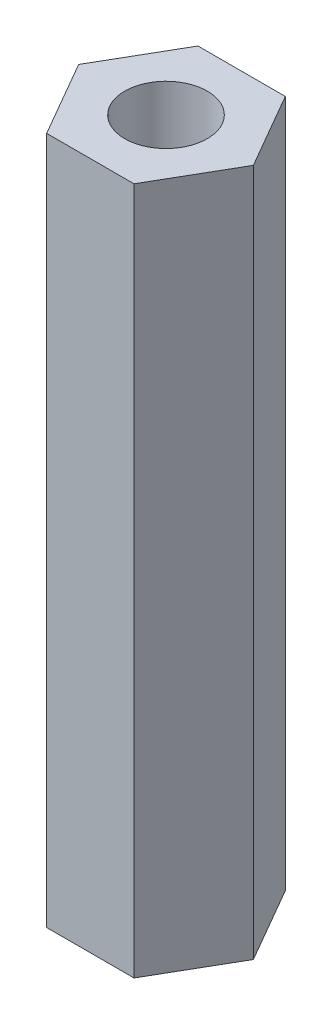
ISO-10303-21;
HEADER;
FILE_DESCRIPTION(('STEP AP214'),'2;1');
FILE_NAME('part.step','',(''),(''),'','','');
FILE_SCHEMA(('AUTOMOTIVE_DESIGN { 1 0 10303 214 1 1 1 1 }'));
ENDSEC;
DATA;
#1=APPLICATION_CONTEXT('core data for automotive mechanical design processes');
#2=APPLICATION_PROTOCOL_DEFINITION('international standard','automotive_design',2000,#1);
#3=PRODUCT_CONTEXT('',#1,'mechanical');
#4=PRODUCT('Part','Part','',(#3));
#5=PRODUCT_RELATED_PRODUCT_CATEGORY('part','',(#4));
#6=PRODUCT_DEFINITION_FORMATION('','',#4);
#7=PRODUCT_DEFINITION_CONTEXT('part definition',#1,'design');
#8=PRODUCT_DEFINITION('design','',#6,#7);
#9=PRODUCT_DEFINITION_SHAPE('','',#8);
#10=(LENGTH_UNIT() NAMED_UNIT(*) SI_UNIT(.MILLI.,.METRE.));
#11=(NAMED_UNIT(*) PLANE_ANGLE_UNIT() SI_UNIT($,.RADIAN.));
#12=(NAMED_UNIT(*) SI_UNIT($,.STERADIAN.) SOLID_ANGLE_UNIT());
#13=UNCERTAINTY_MEASURE_WITH_UNIT(LENGTH_MEASURE(1.E-05),#10,'distance_accuracy_value','');
#14=(GEOMETRIC_REPRESENTATION_CONTEXT(3) GLOBAL_UNCERTAINTY_ASSIGNED_CONTEXT((#13)) GLOBAL_UNIT_ASSIGNED_CONTEXT((#10,
#11,#12)) REPRESENTATION_CONTEXT('',''));
#15=CARTESIAN_POINT('',(0.,0.,0.));
#16=DIRECTION('',(0.,0.,1.));
#17=DIRECTION('',(1.,0.,0.));
#18=AXIS2_PLACEMENT_3D('',#15,#16,#17);
#19=CARTESIAN_POINT('',(0.,25.,0.));
#20=DIRECTION('',(0.,1.,0.));
#21=DIRECTION('',(0.,0.,1.));
#22=AXIS2_PLACEMENT_3D('',#19,#20,#21);
#23=PLANE('',#22);
#24=DIRECTION('',(0.5,0.,-0.866025403784439));
#25=VECTOR('',#24,1.);
#26=CARTESIAN_POINT('',(-5.73489304903012,25.,-4.82224059461863));
#27=LINE('',#26,#25);
#28=CARTESIAN_POINT('',(-5.73489304903012,25.,-4.82224059461863));
#29=VERTEX_POINT('',#28);
#30=CARTESIAN_POINT('',(-4.14717980875865,25.,-7.57224059461863));
#31=VERTEX_POINT('',#30);
#32=EDGE_CURVE('E133',#29,#31,#27,.T.);
#33=ORIENTED_EDGE('',*,*,#32,.T.);
#34=DIRECTION('',(-0.5,0.,-0.866025403784439));
#35=VECTOR('',#34,1.);
#36=CARTESIAN_POINT('',(-4.14717980875865,25.,-7.57224059461863));
#37=LINE('',#36,#35);
#38=CARTESIAN_POINT('',(-5.73489304903012,25.,-10.3222405946186));
#39=VERTEX_POINT('',#38);
#40=EDGE_CURVE('E91',#31,#39,#37,.T.);
#41=ORIENTED_EDGE('',*,*,#40,.T.);
#42=DIRECTION('',(-1.,0.,0.));
#43=VECTOR('',#42,1.);
#44=CARTESIAN_POINT('',(-5.73489304903012,25.,-10.3222405946186));
#45=LINE('',#44,#43);
#46=CARTESIAN_POINT('',(-8.91031952957306,25.,-10.3222405946186));
#47=VERTEX_POINT('',#46);
#48=EDGE_CURVE('E104',#39,#47,#45,.T.);
#49=ORIENTED_EDGE('',*,*,#48,.T.);
#50=DIRECTION('',(-0.5,0.,0.866025403784439));
#51=VECTOR('',#50,1.);
#52=CARTESIAN_POINT('',(-8.91031952957306,25.,-10.3222405946186));
#53=LINE('',#52,#51);
#54=CARTESIAN_POINT('',(-10.4980327698445,25.,-7.57224059461863));
#55=VERTEX_POINT('',#54);
#56=EDGE_CURVE('E98',#47,#55,#53,.T.);
#57=ORIENTED_EDGE('',*,*,#56,.T.);
#58=DIRECTION('',(0.5,0.,0.866025403784439));
#59=VECTOR('',#58,1.);
#60=CARTESIAN_POINT('',(-10.4980327698445,25.,-7.57224059461863));
#61=LINE('',#60,#59);
#62=CARTESIAN_POINT('',(-8.91031952957306,25.,-4.82224059461863));
#63=VERTEX_POINT('',#62);
#64=EDGE_CURVE('E102',#55,#63,#61,.T.);
#65=ORIENTED_EDGE('',*,*,#64,.T.);
#66=DIRECTION('',(1.,0.,0.));
#67=VECTOR('',#66,1.);
#68=CARTESIAN_POINT('',(-8.91031952957306,25.,-4.82224059461863));
#69=LINE('',#68,#67);
#70=EDGE_CURVE('E54',#63,#29,#69,.T.);
#71=ORIENTED_EDGE('',*,*,#70,.T.);
#72=EDGE_LOOP('',(#33,#41,#49,#57,#65,#71));
#73=FACE_BOUND('',#72,.T.);
#74=CARTESIAN_POINT('',(-7.32260628930159,25.,-7.57224059461863));
#75=DIRECTION('',(0.,1.,0.));
#76=DIRECTION('',(0.,0.,1.));
#77=AXIS2_PLACEMENT_3D('',#74,#75,#76);
#78=CIRCLE('',#77,1.5);
#79=CARTESIAN_POINT('',(-7.32260628930159,25.,-6.07224059461863));
#80=VERTEX_POINT('',#79);
#81=EDGE_CURVE('E126',#80,#80,#78,.T.);
#82=ORIENTED_EDGE('',*,*,#81,.F.);
#83=EDGE_LOOP('',(#82));
#84=FACE_BOUND('',#83,.T.);
#85=ADVANCED_FACE('F37',(#73,#84),#23,.T.);
#86=CARTESIAN_POINT('',(0.,0.,0.));
#87=DIRECTION('',(0.,1.,0.));
#88=DIRECTION('',(0.,0.,1.));
#89=AXIS2_PLACEMENT_3D('',#86,#87,#88);
#90=PLANE('',#89);
#91=DIRECTION('',(0.5,0.,-0.866025403784439));
#92=VECTOR('',#91,1.);
#93=CARTESIAN_POINT('',(-5.73489304903012,0.,-4.82224059461863));
#94=LINE('',#93,#92);
#95=CARTESIAN_POINT('',(-5.73489304903012,0.,-4.82224059461863));
#96=VERTEX_POINT('',#95);
#97=CARTESIAN_POINT('',(-4.14717980875865,0.,-7.57224059461863));
#98=VERTEX_POINT('',#97);
#99=EDGE_CURVE('E122',#96,#98,#94,.T.);
#100=ORIENTED_EDGE('',*,*,#99,.F.);
#101=DIRECTION('',(1.,0.,0.));
#102=VECTOR('',#101,1.);
#103=CARTESIAN_POINT('',(-8.91031952957306,0.,-4.82224059461863));
#104=LINE('',#103,#102);
#105=CARTESIAN_POINT('',(-8.91031952957306,0.,-4.82224059461863));
#106=VERTEX_POINT('',#105);
#107=EDGE_CURVE('E83',#106,#96,#104,.T.);
#108=ORIENTED_EDGE('',*,*,#107,.F.);
#109=DIRECTION('',(0.5,0.,0.866025403784439));
#110=VECTOR('',#109,1.);
#111=CARTESIAN_POINT('',(-10.4980327698445,0.,-7.57224059461863));
#112=LINE('',#111,#110);
#113=CARTESIAN_POINT('',(-10.4980327698445,0.,-7.57224059461863));
#114=VERTEX_POINT('',#113);
#115=EDGE_CURVE('E77',#114,#106,#112,.T.);
#116=ORIENTED_EDGE('',*,*,#115,.F.);
#117=DIRECTION('',(-0.5,0.,0.866025403784439));
#118=VECTOR('',#117,1.);
#119=CARTESIAN_POINT('',(-8.91031952957306,0.,-10.3222405946186));
#120=LINE('',#119,#118);
#121=CARTESIAN_POINT('',(-8.91031952957306,0.,-10.3222405946186));
#122=VERTEX_POINT('',#121);
#123=EDGE_CURVE('E112',#122,#114,#120,.T.);
#124=ORIENTED_EDGE('',*,*,#123,.F.);
#125=DIRECTION('',(-1.,0.,0.));
#126=VECTOR('',#125,1.);
#127=CARTESIAN_POINT('',(-5.73489304903012,0.,-10.3222405946186));
#128=LINE('',#127,#126);
#129=CARTESIAN_POINT('',(-5.73489304903012,0.,-10.3222405946186));
#130=VERTEX_POINT('',#129);
#131=EDGE_CURVE('E128',#130,#122,#128,.T.);
#132=ORIENTED_EDGE('',*,*,#131,.F.);
#133=DIRECTION('',(-0.5,0.,-0.866025403784439));
#134=VECTOR('',#133,1.);
#135=CARTESIAN_POINT('',(-4.14717980875865,0.,-7.57224059461863));
#136=LINE('',#135,#134);
#137=EDGE_CURVE('E125',#98,#130,#136,.T.);
#138=ORIENTED_EDGE('',*,*,#137,.F.);
#139=EDGE_LOOP('',(#100,#108,#116,#124,#132,#138));
#140=FACE_BOUND('',#139,.T.);
#141=CARTESIAN_POINT('',(-7.32260628930159,0.,-7.57224059461863));
#142=DIRECTION('',(0.,1.,0.));
#143=DIRECTION('',(0.,0.,1.));
#144=AXIS2_PLACEMENT_3D('',#141,#142,#143);
#145=CIRCLE('',#144,1.5);
#146=CARTESIAN_POINT('',(-7.32260628930159,0.,-6.07224059461863));
#147=VERTEX_POINT('',#146);
#148=EDGE_CURVE('E226',#147,#147,#145,.T.);
#149=ORIENTED_EDGE('',*,*,#148,.T.);
#150=EDGE_LOOP('',(#149));
#151=FACE_BOUND('',#150,.T.);
#152=ADVANCED_FACE('F142',(#140,#151),#90,.F.);
#153=CARTESIAN_POINT('',(-5.73489304903012,25.,-4.82224059461863));
#154=DIRECTION('',(-0.866025403784439,0.,-0.5));
#155=DIRECTION('',(-0.5,0.,0.866025403784439));
#156=AXIS2_PLACEMENT_3D('',#153,#154,#155);
#157=PLANE('',#156);
#158=ORIENTED_EDGE('',*,*,#99,.T.);
#159=DIRECTION('',(0.,-1.,0.));
#160=VECTOR('',#159,1.);
#161=CARTESIAN_POINT('',(-4.14717980875865,25.,-7.57224059461863));
#162=LINE('',#161,#160);
#163=EDGE_CURVE('E11',#31,#98,#162,.T.);
#164=ORIENTED_EDGE('',*,*,#163,.F.);
#165=ORIENTED_EDGE('',*,*,#32,.F.);
#166=DIRECTION('',(0.,-1.,0.));
#167=VECTOR('',#166,1.);
#168=CARTESIAN_POINT('',(-5.73489304903012,25.,-4.82224059461863));
#169=LINE('',#168,#167);
#170=EDGE_CURVE('E118',#29,#96,#169,.T.);
#171=ORIENTED_EDGE('',*,*,#170,.T.);
#172=EDGE_LOOP('',(#158,#164,#165,#171));
#173=FACE_BOUND('',#172,.T.);
#174=ADVANCED_FACE('F39',(#173),#157,.F.);
#175=CARTESIAN_POINT('',(-4.14717980875865,25.,-7.57224059461863));
#176=DIRECTION('',(-0.866025403784439,0.,0.5));
#177=DIRECTION('',(0.5,0.,0.866025403784439));
#178=AXIS2_PLACEMENT_3D('',#175,#176,#177);
#179=PLANE('',#178);
#180=ORIENTED_EDGE('',*,*,#137,.T.);
#181=DIRECTION('',(0.,-1.,0.));
#182=VECTOR('',#181,1.);
#183=CARTESIAN_POINT('',(-5.73489304903012,25.,-10.3222405946186));
#184=LINE('',#183,#182);
#185=EDGE_CURVE('E46',#39,#130,#184,.T.);
#186=ORIENTED_EDGE('',*,*,#185,.F.);
#187=ORIENTED_EDGE('',*,*,#40,.F.);
#188=ORIENTED_EDGE('',*,*,#163,.T.);
#189=EDGE_LOOP('',(#180,#186,#187,#188));
#190=FACE_BOUND('',#189,.T.);
#191=ADVANCED_FACE('F167',(#190),#179,.F.);
#192=CARTESIAN_POINT('',(-5.73489304903012,25.,-10.3222405946186));
#193=DIRECTION('',(0.,0.,1.));
#194=DIRECTION('',(1.,0.,0.));
#195=AXIS2_PLACEMENT_3D('',#192,#193,#194);
#196=PLANE('',#195);
#197=ORIENTED_EDGE('',*,*,#131,.T.);
#198=DIRECTION('',(0.,-1.,0.));
#199=VECTOR('',#198,1.);
#200=CARTESIAN_POINT('',(-8.91031952957306,25.,-10.3222405946186));
#201=LINE('',#200,#199);
#202=EDGE_CURVE('E113',#47,#122,#201,.T.);
#203=ORIENTED_EDGE('',*,*,#202,.F.);
#204=ORIENTED_EDGE('',*,*,#48,.F.);
#205=ORIENTED_EDGE('',*,*,#185,.T.);
#206=EDGE_LOOP('',(#197,#203,#204,#205));
#207=FACE_BOUND('',#206,.T.);
#208=ADVANCED_FACE('F139',(#207),#196,.F.);
#209=CARTESIAN_POINT('',(-8.91031952957306,25.,-10.3222405946186));
#210=DIRECTION('',(0.866025403784439,0.,0.5));
#211=DIRECTION('',(0.5,0.,-0.866025403784439));
#212=AXIS2_PLACEMENT_3D('',#209,#210,#211);
#213=PLANE('',#212);
#214=ORIENTED_EDGE('',*,*,#123,.T.);
#215=DIRECTION('',(0.,-1.,0.));
#216=VECTOR('',#215,1.);
#217=CARTESIAN_POINT('',(-10.4980327698445,25.,-7.57224059461863));
#218=LINE('',#217,#216);
#219=EDGE_CURVE('E109',#55,#114,#218,.T.);
#220=ORIENTED_EDGE('',*,*,#219,.F.);
#221=ORIENTED_EDGE('',*,*,#56,.F.);
#222=ORIENTED_EDGE('',*,*,#202,.T.);
#223=EDGE_LOOP('',(#214,#220,#221,#222));
#224=FACE_BOUND('',#223,.T.);
#225=ADVANCED_FACE('F110',(#224),#213,.F.);
#226=CARTESIAN_POINT('',(-10.4980327698445,25.,-7.57224059461863));
#227=DIRECTION('',(0.866025403784439,0.,-0.5));
#228=DIRECTION('',(-0.5,0.,-0.866025403784439));
#229=AXIS2_PLACEMENT_3D('',#226,#227,#228);
#230=PLANE('',#229);
#231=ORIENTED_EDGE('',*,*,#115,.T.);
#232=DIRECTION('',(0.,-1.,0.));
#233=VECTOR('',#232,1.);
#234=CARTESIAN_POINT('',(-8.91031952957306,25.,-4.82224059461863));
#235=LINE('',#234,#233);
#236=EDGE_CURVE('E114',#63,#106,#235,.T.);
#237=ORIENTED_EDGE('',*,*,#236,.F.);
#238=ORIENTED_EDGE('',*,*,#64,.F.);
#239=ORIENTED_EDGE('',*,*,#219,.T.);
#240=EDGE_LOOP('',(#231,#237,#238,#239));
#241=FACE_BOUND('',#240,.T.);
#242=ADVANCED_FACE('F116',(#241),#230,.F.);
#243=CARTESIAN_POINT('',(-8.91031952957306,25.,-4.82224059461863));
#244=DIRECTION('',(0.,0.,-1.));
#245=DIRECTION('',(-1.,0.,0.));
#246=AXIS2_PLACEMENT_3D('',#243,#244,#245);
#247=PLANE('',#246);
#248=ORIENTED_EDGE('',*,*,#107,.T.);
#249=ORIENTED_EDGE('',*,*,#170,.F.);
#250=ORIENTED_EDGE('',*,*,#70,.F.);
#251=ORIENTED_EDGE('',*,*,#236,.T.);
#252=EDGE_LOOP('',(#248,#249,#250,#251));
#253=FACE_BOUND('',#252,.T.);
#254=ADVANCED_FACE('F147',(#253),#247,.F.);
#255=CARTESIAN_POINT('',(-7.32260628930159,25.,-7.57224059461863));
#256=DIRECTION('',(0.,-1.,0.));
#257=DIRECTION('',(0.,0.,-1.));
#258=AXIS2_PLACEMENT_3D('',#255,#256,#257);
#259=CYLINDRICAL_SURFACE('',#258,1.5);
#260=ORIENTED_EDGE('',*,*,#81,.T.);
#261=EDGE_LOOP('',(#260));
#262=FACE_BOUND('',#261,.T.);
#263=ORIENTED_EDGE('',*,*,#148,.F.);
#264=EDGE_LOOP('',(#263));
#265=FACE_BOUND('',#264,.T.);
#266=ADVANCED_FACE('F149',(#262,#265),#259,.F.);
#267=CLOSED_SHELL('',(#85,#152,#174,#191,#208,#225,#242,#254,#266));
#268=MANIFOLD_SOLID_BREP('B2',#267);
#269=ADVANCED_BREP_SHAPE_REPRESENTATION('',(#18,#268),#14);
#270=SHAPE_DEFINITION_REPRESENTATION(#9,#269);
ENDSEC;
END-ISO-10303-21;
